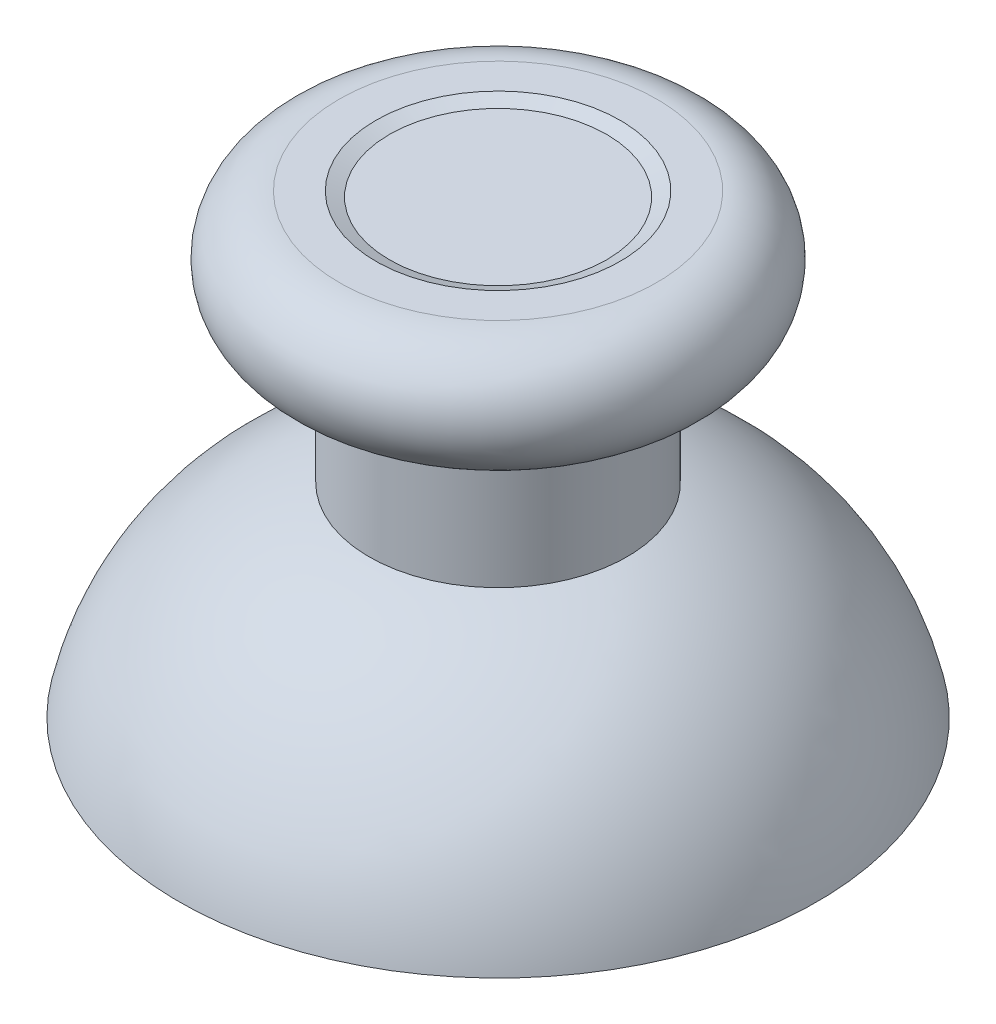
ISO-10303-21;
HEADER;
FILE_DESCRIPTION(('STEP AP214'),'2;1');
FILE_NAME('part.step','',(''),(''),'','','');
FILE_SCHEMA(('AUTOMOTIVE_DESIGN { 1 0 10303 214 1 1 1 1 }'));
ENDSEC;
DATA;
#1=APPLICATION_CONTEXT('core data for automotive mechanical design processes');
#2=APPLICATION_PROTOCOL_DEFINITION('international standard','automotive_design',2000,#1);
#3=PRODUCT_CONTEXT('',#1,'mechanical');
#4=PRODUCT('Part','Part','',(#3));
#5=PRODUCT_RELATED_PRODUCT_CATEGORY('part','',(#4));
#6=PRODUCT_DEFINITION_FORMATION('','',#4);
#7=PRODUCT_DEFINITION_CONTEXT('part definition',#1,'design');
#8=PRODUCT_DEFINITION('design','',#6,#7);
#9=PRODUCT_DEFINITION_SHAPE('','',#8);
#10=(LENGTH_UNIT() NAMED_UNIT(*) SI_UNIT(.MILLI.,.METRE.));
#11=(NAMED_UNIT(*) PLANE_ANGLE_UNIT() SI_UNIT($,.RADIAN.));
#12=(NAMED_UNIT(*) SI_UNIT($,.STERADIAN.) SOLID_ANGLE_UNIT());
#13=UNCERTAINTY_MEASURE_WITH_UNIT(LENGTH_MEASURE(1.E-05),#10,'distance_accuracy_value','');
#14=(GEOMETRIC_REPRESENTATION_CONTEXT(3) GLOBAL_UNCERTAINTY_ASSIGNED_CONTEXT((#13)) GLOBAL_UNIT_ASSIGNED_CONTEXT((#10,
#11,#12)) REPRESENTATION_CONTEXT('',''));
#15=CARTESIAN_POINT('',(0.,0.,0.));
#16=DIRECTION('',(0.,0.,1.));
#17=DIRECTION('',(1.,0.,0.));
#18=AXIS2_PLACEMENT_3D('',#15,#16,#17);
#19=CARTESIAN_POINT('',(0.,2.5,0.));
#20=DIRECTION('',(0.,-1.,0.));
#21=DIRECTION('',(1.,0.,0.));
#22=AXIS2_PLACEMENT_3D('',#19,#20,#21);
#23=PLANE('',#22);
#24=CARTESIAN_POINT('',(0.,2.5,0.));
#25=DIRECTION('',(0.,-1.,0.));
#26=DIRECTION('',(1.,0.,0.));
#27=AXIS2_PLACEMENT_3D('',#24,#25,#26);
#28=CIRCLE('',#27,2.5);
#29=CARTESIAN_POINT('',(2.5,2.5,0.));
#30=VERTEX_POINT('',#29);
#31=EDGE_CURVE('E97',#30,#30,#28,.T.);
#32=ORIENTED_EDGE('',*,*,#31,.T.);
#33=EDGE_LOOP('',(#32));
#34=FACE_BOUND('',#33,.T.);
#35=DIRECTION('',(0.,0.,1.));
#36=VECTOR('',#35,1.);
#37=CARTESIAN_POINT('',(1.5,2.5,0.));
#38=LINE('',#37,#36);
#39=CARTESIAN_POINT('',(1.5,2.5,-0.499999999999999));
#40=VERTEX_POINT('',#39);
#41=CARTESIAN_POINT('',(1.5,2.5,0.499999999999999));
#42=VERTEX_POINT('',#41);
#43=EDGE_CURVE('E61',#40,#42,#38,.T.);
#44=ORIENTED_EDGE('',*,*,#43,.F.);
#45=CARTESIAN_POINT('',(0.,2.5,-0.5));
#46=DIRECTION('',(0.,-1.,0.));
#47=DIRECTION('',(1.,0.,0.));
#48=AXIS2_PLACEMENT_3D('',#45,#46,#47);
#49=CIRCLE('',#48,1.5);
#50=CARTESIAN_POINT('',(-1.5,2.5,-0.5));
#51=VERTEX_POINT('',#50);
#52=EDGE_CURVE('E12',#40,#51,#49,.F.);
#53=ORIENTED_EDGE('',*,*,#52,.T.);
#54=DIRECTION('',(0.,0.,1.));
#55=VECTOR('',#54,1.);
#56=CARTESIAN_POINT('',(-1.5,2.5,0.));
#57=LINE('',#56,#55);
#58=CARTESIAN_POINT('',(-1.5,2.5,0.5));
#59=VERTEX_POINT('',#58);
#60=EDGE_CURVE('E96',#51,#59,#57,.T.);
#61=ORIENTED_EDGE('',*,*,#60,.T.);
#62=CARTESIAN_POINT('',(0.,2.5,0.5));
#63=DIRECTION('',(0.,-1.,0.));
#64=DIRECTION('',(1.,0.,0.));
#65=AXIS2_PLACEMENT_3D('',#62,#63,#64);
#66=CIRCLE('',#65,1.5);
#67=EDGE_CURVE('E150',#59,#42,#66,.F.);
#68=ORIENTED_EDGE('',*,*,#67,.T.);
#69=EDGE_LOOP('',(#44,#53,#61,#68));
#70=FACE_BOUND('',#69,.T.);
#71=ADVANCED_FACE('F53',(#34,#70),#23,.T.);
#72=CARTESIAN_POINT('',(0.,-1.85841909954089,0.));
#73=DIRECTION('',(0.,1.,0.));
#74=DIRECTION('',(-1.,0.,0.));
#75=AXIS2_PLACEMENT_3D('',#72,#73,#74);
#76=DEGENERATE_TOROIDAL_SURFACE('',#75,2.,8.35841909954089,.T.);
#77=CARTESIAN_POINT('',(0.,0.,0.));
#78=DIRECTION('',(0.,1.,0.));
#79=DIRECTION('',(-1.,0.,0.));
#80=AXIS2_PLACEMENT_3D('',#77,#78,#79);
#81=CIRCLE('',#80,10.1491992425042);
#82=CARTESIAN_POINT('',(-10.1491992425042,0.,0.));
#83=VERTEX_POINT('',#82);
#84=EDGE_CURVE('E144',#83,#83,#81,.T.);
#85=ORIENTED_EDGE('',*,*,#84,.F.);
#86=EDGE_LOOP('',(#85));
#87=FACE_BOUND('',#86,.T.);
#88=CARTESIAN_POINT('',(0.,6.48503161605454,0.));
#89=DIRECTION('',(0.,-1.,0.));
#90=DIRECTION('',(1.,0.,0.));
#91=AXIS2_PLACEMENT_3D('',#88,#89,#90);
#92=CIRCLE('',#91,2.5);
#93=CARTESIAN_POINT('',(2.5,6.48503161605454,0.));
#94=VERTEX_POINT('',#93);
#95=EDGE_CURVE('E122',#94,#94,#92,.F.);
#96=ORIENTED_EDGE('',*,*,#95,.T.);
#97=EDGE_LOOP('',(#96));
#98=FACE_BOUND('',#97,.T.);
#99=ADVANCED_FACE('F55',(#87,#98),#76,.F.);
#100=CARTESIAN_POINT('',(0.,0.,0.));
#101=DIRECTION('',(0.,1.,0.));
#102=DIRECTION('',(-1.,0.,0.));
#103=AXIS2_PLACEMENT_3D('',#100,#101,#102);
#104=PLANE('',#103);
#105=CARTESIAN_POINT('',(0.,0.,0.));
#106=DIRECTION('',(0.,1.,0.));
#107=DIRECTION('',(-1.,0.,0.));
#108=AXIS2_PLACEMENT_3D('',#105,#106,#107);
#109=CIRCLE('',#108,11.75);
#110=CARTESIAN_POINT('',(-11.75,0.,0.));
#111=VERTEX_POINT('',#110);
#112=EDGE_CURVE('E141',#111,#111,#109,.T.);
#113=ORIENTED_EDGE('',*,*,#112,.F.);
#114=EDGE_LOOP('',(#113));
#115=FACE_BOUND('',#114,.T.);
#116=ORIENTED_EDGE('',*,*,#84,.T.);
#117=EDGE_LOOP('',(#116));
#118=FACE_BOUND('',#117,.T.);
#119=ADVANCED_FACE('F165',(#115,#118),#104,.F.);
#120=CARTESIAN_POINT('',(0.,-2.10711699366119,0.));
#121=DIRECTION('',(0.,1.,0.));
#122=DIRECTION('',(-1.,0.,0.));
#123=AXIS2_PLACEMENT_3D('',#120,#121,#122);
#124=DEGENERATE_TOROIDAL_SURFACE('',#123,1.97451750679158,10.,.T.);
#125=ORIENTED_EDGE('',*,*,#112,.T.);
#126=EDGE_LOOP('',(#125));
#127=FACE_BOUND('',#126,.T.);
#128=CARTESIAN_POINT('',(0.,7.5,0.));
#129=DIRECTION('',(0.,1.,0.));
#130=DIRECTION('',(-1.,0.,0.));
#131=AXIS2_PLACEMENT_3D('',#128,#129,#130);
#132=CIRCLE('',#131,4.75);
#133=CARTESIAN_POINT('',(-4.75,7.5,0.));
#134=VERTEX_POINT('',#133);
#135=EDGE_CURVE('E138',#134,#134,#132,.T.);
#136=ORIENTED_EDGE('',*,*,#135,.F.);
#137=EDGE_LOOP('',(#136));
#138=FACE_BOUND('',#137,.T.);
#139=ADVANCED_FACE('F197',(#127,#138),#124,.T.);
#140=CARTESIAN_POINT('',(0.,0.,0.));
#141=DIRECTION('',(0.,1.,0.));
#142=DIRECTION('',(-1.,0.,0.));
#143=AXIS2_PLACEMENT_3D('',#140,#141,#142);
#144=CYLINDRICAL_SURFACE('',#143,4.75);
#145=CARTESIAN_POINT('',(0.,12.5,0.));
#146=DIRECTION('',(0.,1.,0.));
#147=DIRECTION('',(-1.,0.,0.));
#148=AXIS2_PLACEMENT_3D('',#145,#146,#147);
#149=CIRCLE('',#148,4.75);
#150=CARTESIAN_POINT('',(-4.75,12.5,0.));
#151=VERTEX_POINT('',#150);
#152=EDGE_CURVE('E135',#151,#151,#149,.T.);
#153=ORIENTED_EDGE('',*,*,#152,.F.);
#154=EDGE_LOOP('',(#153));
#155=FACE_BOUND('',#154,.T.);
#156=ORIENTED_EDGE('',*,*,#135,.T.);
#157=EDGE_LOOP('',(#156));
#158=FACE_BOUND('',#157,.T.);
#159=ADVANCED_FACE('F193',(#155,#158),#144,.T.);
#160=CARTESIAN_POINT('',(0.,12.5,0.));
#161=DIRECTION('',(0.,1.,0.));
#162=DIRECTION('',(-1.,0.,0.));
#163=AXIS2_PLACEMENT_3D('',#160,#161,#162);
#164=PLANE('',#163);
#165=CARTESIAN_POINT('',(0.,12.5,0.));
#166=DIRECTION('',(0.,1.,0.));
#167=DIRECTION('',(-1.,0.,0.));
#168=AXIS2_PLACEMENT_3D('',#165,#166,#167);
#169=CIRCLE('',#168,5.85);
#170=CARTESIAN_POINT('',(-5.85,12.5,0.));
#171=VERTEX_POINT('',#170);
#172=EDGE_CURVE('E132',#171,#171,#169,.T.);
#173=ORIENTED_EDGE('',*,*,#172,.F.);
#174=EDGE_LOOP('',(#173));
#175=FACE_BOUND('',#174,.T.);
#176=ORIENTED_EDGE('',*,*,#152,.T.);
#177=EDGE_LOOP('',(#176));
#178=FACE_BOUND('',#177,.T.);
#179=ADVANCED_FACE('F189',(#175,#178),#164,.F.);
#180=CARTESIAN_POINT('',(0.,14.65,0.));
#181=DIRECTION('',(0.,1.,0.));
#182=DIRECTION('',(-1.,0.,0.));
#183=AXIS2_PLACEMENT_3D('',#180,#181,#182);
#184=TOROIDAL_SURFACE('',#183,5.85,2.15);
#185=CARTESIAN_POINT('',(0.,16.8,0.));
#186=DIRECTION('',(0.,1.,0.));
#187=DIRECTION('',(-1.,0.,0.));
#188=AXIS2_PLACEMENT_3D('',#185,#186,#187);
#189=CIRCLE('',#188,5.85);
#190=CARTESIAN_POINT('',(-5.85,16.8,0.));
#191=VERTEX_POINT('',#190);
#192=EDGE_CURVE('E129',#191,#191,#189,.T.);
#193=ORIENTED_EDGE('',*,*,#192,.F.);
#194=EDGE_LOOP('',(#193));
#195=FACE_BOUND('',#194,.T.);
#196=ORIENTED_EDGE('',*,*,#172,.T.);
#197=EDGE_LOOP('',(#196));
#198=FACE_BOUND('',#197,.T.);
#199=ADVANCED_FACE('F185',(#195,#198),#184,.T.);
#200=CARTESIAN_POINT('',(0.,16.8,0.));
#201=DIRECTION('',(0.,1.,0.));
#202=DIRECTION('',(-1.,0.,0.));
#203=AXIS2_PLACEMENT_3D('',#200,#201,#202);
#204=PLANE('',#203);
#205=ORIENTED_EDGE('',*,*,#192,.T.);
#206=EDGE_LOOP('',(#205));
#207=FACE_BOUND('',#206,.T.);
#208=CARTESIAN_POINT('',(0.,16.8,0.));
#209=DIRECTION('',(0.,1.,0.));
#210=DIRECTION('',(-1.,0.,0.));
#211=AXIS2_PLACEMENT_3D('',#208,#209,#210);
#212=CIRCLE('',#211,4.49999999999997);
#213=CARTESIAN_POINT('',(-4.49999999999998,16.8,0.));
#214=VERTEX_POINT('',#213);
#215=EDGE_CURVE('E126',#214,#214,#212,.T.);
#216=ORIENTED_EDGE('',*,*,#215,.F.);
#217=EDGE_LOOP('',(#216));
#218=FACE_BOUND('',#217,.T.);
#219=ADVANCED_FACE('F181',(#207,#218),#204,.T.);
#220=CARTESIAN_POINT('',(0.,16.8,0.));
#221=DIRECTION('',(0.,1.,0.));
#222=DIRECTION('',(-1.,0.,0.));
#223=AXIS2_PLACEMENT_3D('',#220,#221,#222);
#224=CONICAL_SURFACE('',#223,4.49999999999997,1.19028994968253);
#225=CARTESIAN_POINT('',(0.,16.6,0.));
#226=DIRECTION('',(0.,1.,0.));
#227=DIRECTION('',(-1.,0.,0.));
#228=AXIS2_PLACEMENT_3D('',#225,#226,#227);
#229=CIRCLE('',#228,4.);
#230=CARTESIAN_POINT('',(-4.,16.6,0.));
#231=VERTEX_POINT('',#230);
#232=EDGE_CURVE('E123',#231,#231,#229,.T.);
#233=ORIENTED_EDGE('',*,*,#232,.F.);
#234=EDGE_LOOP('',(#233));
#235=FACE_BOUND('',#234,.T.);
#236=ORIENTED_EDGE('',*,*,#215,.T.);
#237=EDGE_LOOP('',(#236));
#238=FACE_BOUND('',#237,.T.);
#239=ADVANCED_FACE('F177',(#235,#238),#224,.F.);
#240=CARTESIAN_POINT('',(0.,16.6,0.));
#241=DIRECTION('',(0.,-1.,0.));
#242=DIRECTION('',(1.,0.,0.));
#243=AXIS2_PLACEMENT_3D('',#240,#241,#242);
#244=PLANE('',#243);
#245=ORIENTED_EDGE('',*,*,#232,.T.);
#246=EDGE_LOOP('',(#245));
#247=FACE_BOUND('',#246,.T.);
#248=ADVANCED_FACE('F173',(#247),#244,.F.);
#249=CARTESIAN_POINT('',(0.,2.5,0.));
#250=DIRECTION('',(0.,1.,0.));
#251=DIRECTION('',(-1.,0.,0.));
#252=AXIS2_PLACEMENT_3D('',#249,#250,#251);
#253=CYLINDRICAL_SURFACE('',#252,2.5);
#254=ORIENTED_EDGE('',*,*,#95,.F.);
#255=EDGE_LOOP('',(#254));
#256=FACE_BOUND('',#255,.T.);
#257=ORIENTED_EDGE('',*,*,#31,.F.);
#258=EDGE_LOOP('',(#257));
#259=FACE_BOUND('',#258,.T.);
#260=ADVANCED_FACE('F170',(#256,#259),#253,.T.);
#261=CARTESIAN_POINT('',(0.,0.,-0.5));
#262=DIRECTION('',(0.,1.,0.));
#263=DIRECTION('',(-1.,0.,0.));
#264=AXIS2_PLACEMENT_3D('',#261,#262,#263);
#265=CYLINDRICAL_SURFACE('',#264,1.5);
#266=DIRECTION('',(0.,1.,0.));
#267=VECTOR('',#266,1.);
#268=CARTESIAN_POINT('',(1.5,0.,-0.499999999999999));
#269=LINE('',#268,#267);
#270=CARTESIAN_POINT('',(1.5,6.5,-0.499999999999999));
#271=VERTEX_POINT('',#270);
#272=EDGE_CURVE('E98',#40,#271,#269,.T.);
#273=ORIENTED_EDGE('',*,*,#272,.T.);
#274=CARTESIAN_POINT('',(0.,6.5,-0.5));
#275=DIRECTION('',(0.,-1.,0.));
#276=DIRECTION('',(1.,0.,0.));
#277=AXIS2_PLACEMENT_3D('',#274,#275,#276);
#278=CIRCLE('',#277,1.5);
#279=CARTESIAN_POINT('',(-1.5,6.5,-0.5));
#280=VERTEX_POINT('',#279);
#281=EDGE_CURVE('E101',#280,#271,#278,.T.);
#282=ORIENTED_EDGE('',*,*,#281,.F.);
#283=DIRECTION('',(0.,1.,0.));
#284=VECTOR('',#283,1.);
#285=CARTESIAN_POINT('',(-1.5,0.,-0.5));
#286=LINE('',#285,#284);
#287=EDGE_CURVE('E90',#51,#280,#286,.T.);
#288=ORIENTED_EDGE('',*,*,#287,.F.);
#289=ORIENTED_EDGE('',*,*,#52,.F.);
#290=EDGE_LOOP('',(#273,#282,#288,#289));
#291=FACE_BOUND('',#290,.T.);
#292=ADVANCED_FACE('F102',(#291),#265,.F.);
#293=CARTESIAN_POINT('',(1.5,0.,0.));
#294=DIRECTION('',(1.,0.,0.));
#295=DIRECTION('',(0.,1.,0.));
#296=AXIS2_PLACEMENT_3D('',#293,#294,#295);
#297=PLANE('',#296);
#298=ORIENTED_EDGE('',*,*,#43,.T.);
#299=DIRECTION('',(0.,1.,0.));
#300=VECTOR('',#299,1.);
#301=CARTESIAN_POINT('',(1.5,0.,0.499999999999999));
#302=LINE('',#301,#300);
#303=CARTESIAN_POINT('',(1.5,6.5,0.499999999999999));
#304=VERTEX_POINT('',#303);
#305=EDGE_CURVE('E117',#42,#304,#302,.T.);
#306=ORIENTED_EDGE('',*,*,#305,.T.);
#307=DIRECTION('',(0.,0.,-1.));
#308=VECTOR('',#307,1.);
#309=CARTESIAN_POINT('',(1.5,6.5,0.));
#310=LINE('',#309,#308);
#311=EDGE_CURVE('E106',#304,#271,#310,.T.);
#312=ORIENTED_EDGE('',*,*,#311,.T.);
#313=ORIENTED_EDGE('',*,*,#272,.F.);
#314=EDGE_LOOP('',(#298,#306,#312,#313));
#315=FACE_BOUND('',#314,.T.);
#316=ADVANCED_FACE('F155',(#315),#297,.F.);
#317=CARTESIAN_POINT('',(0.,0.,0.5));
#318=DIRECTION('',(0.,1.,0.));
#319=DIRECTION('',(-1.,0.,0.));
#320=AXIS2_PLACEMENT_3D('',#317,#318,#319);
#321=CYLINDRICAL_SURFACE('',#320,1.5);
#322=DIRECTION('',(0.,1.,0.));
#323=VECTOR('',#322,1.);
#324=CARTESIAN_POINT('',(-1.5,0.,0.5));
#325=LINE('',#324,#323);
#326=CARTESIAN_POINT('',(-1.5,6.5,0.5));
#327=VERTEX_POINT('',#326);
#328=EDGE_CURVE('E68',#59,#327,#325,.T.);
#329=ORIENTED_EDGE('',*,*,#328,.T.);
#330=CARTESIAN_POINT('',(0.,6.5,0.5));
#331=DIRECTION('',(0.,-1.,0.));
#332=DIRECTION('',(1.,0.,0.));
#333=AXIS2_PLACEMENT_3D('',#330,#331,#332);
#334=CIRCLE('',#333,1.5);
#335=EDGE_CURVE('E111',#304,#327,#334,.T.);
#336=ORIENTED_EDGE('',*,*,#335,.F.);
#337=ORIENTED_EDGE('',*,*,#305,.F.);
#338=ORIENTED_EDGE('',*,*,#67,.F.);
#339=EDGE_LOOP('',(#329,#336,#337,#338));
#340=FACE_BOUND('',#339,.T.);
#341=ADVANCED_FACE('F158',(#340),#321,.F.);
#342=CARTESIAN_POINT('',(-1.5,0.,0.));
#343=DIRECTION('',(1.,0.,0.));
#344=DIRECTION('',(0.,1.,0.));
#345=AXIS2_PLACEMENT_3D('',#342,#343,#344);
#346=PLANE('',#345);
#347=ORIENTED_EDGE('',*,*,#287,.T.);
#348=DIRECTION('',(0.,0.,-1.));
#349=VECTOR('',#348,1.);
#350=CARTESIAN_POINT('',(-1.5,6.5,0.));
#351=LINE('',#350,#349);
#352=EDGE_CURVE('E94',#327,#280,#351,.T.);
#353=ORIENTED_EDGE('',*,*,#352,.F.);
#354=ORIENTED_EDGE('',*,*,#328,.F.);
#355=ORIENTED_EDGE('',*,*,#60,.F.);
#356=EDGE_LOOP('',(#347,#353,#354,#355));
#357=FACE_BOUND('',#356,.T.);
#358=ADVANCED_FACE('F92',(#357),#346,.T.);
#359=CARTESIAN_POINT('',(0.,6.5,0.));
#360=DIRECTION('',(0.,-1.,0.));
#361=DIRECTION('',(1.,0.,0.));
#362=AXIS2_PLACEMENT_3D('',#359,#360,#361);
#363=PLANE('',#362);
#364=ORIENTED_EDGE('',*,*,#352,.T.);
#365=ORIENTED_EDGE('',*,*,#281,.T.);
#366=ORIENTED_EDGE('',*,*,#311,.F.);
#367=ORIENTED_EDGE('',*,*,#335,.T.);
#368=EDGE_LOOP('',(#364,#365,#366,#367));
#369=FACE_BOUND('',#368,.T.);
#370=ADVANCED_FACE('F109',(#369),#363,.T.);
#371=CLOSED_SHELL('',(#71,#99,#119,#139,#159,#179,#199,#219,#239,#248,#260,#292,#316,#341,#358,#370));
#372=MANIFOLD_SOLID_BREP('B2',#371);
#373=ADVANCED_BREP_SHAPE_REPRESENTATION('',(#18,#372),#14);
#374=SHAPE_DEFINITION_REPRESENTATION(#9,#373);
ENDSEC;
END-ISO-10303-21;
